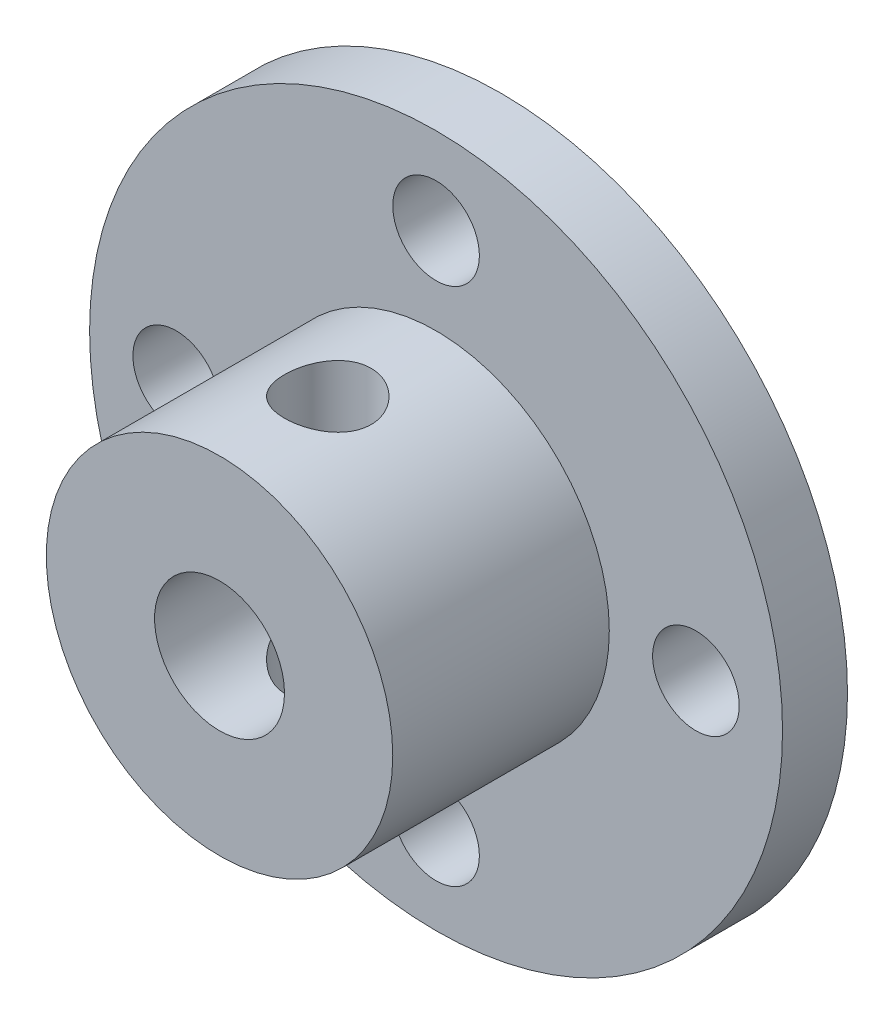
ISO-10303-21;
HEADER;
FILE_DESCRIPTION(('STEP AP214'),'2;1');
FILE_NAME('part.step','',(''),(''),'','','');
FILE_SCHEMA(('AUTOMOTIVE_DESIGN { 1 0 10303 214 1 1 1 1 }'));
ENDSEC;
DATA;
#1=APPLICATION_CONTEXT('core data for automotive mechanical design processes');
#2=APPLICATION_PROTOCOL_DEFINITION('international standard','automotive_design',2000,#1);
#3=PRODUCT_CONTEXT('',#1,'mechanical');
#4=PRODUCT('Part','Part','',(#3));
#5=PRODUCT_RELATED_PRODUCT_CATEGORY('part','',(#4));
#6=PRODUCT_DEFINITION_FORMATION('','',#4);
#7=PRODUCT_DEFINITION_CONTEXT('part definition',#1,'design');
#8=PRODUCT_DEFINITION('design','',#6,#7);
#9=PRODUCT_DEFINITION_SHAPE('','',#8);
#10=(LENGTH_UNIT() NAMED_UNIT(*) SI_UNIT(.MILLI.,.METRE.));
#11=(NAMED_UNIT(*) PLANE_ANGLE_UNIT() SI_UNIT($,.RADIAN.));
#12=(NAMED_UNIT(*) SI_UNIT($,.STERADIAN.) SOLID_ANGLE_UNIT());
#13=UNCERTAINTY_MEASURE_WITH_UNIT(LENGTH_MEASURE(1.E-05),#10,'distance_accuracy_value','');
#14=(GEOMETRIC_REPRESENTATION_CONTEXT(3) GLOBAL_UNCERTAINTY_ASSIGNED_CONTEXT((#13)) GLOBAL_UNIT_ASSIGNED_CONTEXT((#10,
#11,#12)) REPRESENTATION_CONTEXT('',''));
#15=CARTESIAN_POINT('',(0.,0.,0.));
#16=DIRECTION('',(0.,0.,1.));
#17=DIRECTION('',(1.,0.,0.));
#18=AXIS2_PLACEMENT_3D('',#15,#16,#17);
#19=CARTESIAN_POINT('',(0.,0.,3.));
#20=DIRECTION('',(0.,0.,-1.));
#21=DIRECTION('',(-1.,0.,0.));
#22=AXIS2_PLACEMENT_3D('',#19,#20,#21);
#23=CYLINDRICAL_SURFACE('',#22,16.);
#24=CARTESIAN_POINT('',(0.,0.,3.));
#25=DIRECTION('',(0.,0.,1.));
#26=DIRECTION('',(1.,0.,0.));
#27=AXIS2_PLACEMENT_3D('',#24,#25,#26);
#28=CIRCLE('',#27,16.);
#29=CARTESIAN_POINT('',(16.,0.,3.));
#30=VERTEX_POINT('',#29);
#31=EDGE_CURVE('E49',#30,#30,#28,.T.);
#32=ORIENTED_EDGE('',*,*,#31,.F.);
#33=EDGE_LOOP('',(#32));
#34=FACE_BOUND('',#33,.T.);
#35=CARTESIAN_POINT('',(0.,0.,0.));
#36=DIRECTION('',(0.,0.,1.));
#37=DIRECTION('',(1.,0.,0.));
#38=AXIS2_PLACEMENT_3D('',#35,#36,#37);
#39=CIRCLE('',#38,16.);
#40=CARTESIAN_POINT('',(16.,0.,0.));
#41=VERTEX_POINT('',#40);
#42=EDGE_CURVE('E54',#41,#41,#39,.T.);
#43=ORIENTED_EDGE('',*,*,#42,.T.);
#44=EDGE_LOOP('',(#43));
#45=FACE_BOUND('',#44,.T.);
#46=ADVANCED_FACE('F37',(#34,#45),#23,.T.);
#47=CARTESIAN_POINT('',(0.,0.,3.));
#48=DIRECTION('',(0.,0.,1.));
#49=DIRECTION('',(1.,0.,0.));
#50=AXIS2_PLACEMENT_3D('',#47,#48,#49);
#51=PLANE('',#50);
#52=CARTESIAN_POINT('',(0.,12.,3.));
#53=DIRECTION('',(0.,0.,1.));
#54=DIRECTION('',(1.,0.,0.));
#55=AXIS2_PLACEMENT_3D('',#52,#53,#54);
#56=CIRCLE('',#55,2.);
#57=CARTESIAN_POINT('',(2.,12.,3.));
#58=VERTEX_POINT('',#57);
#59=EDGE_CURVE('E149',#58,#58,#56,.T.);
#60=ORIENTED_EDGE('',*,*,#59,.F.);
#61=EDGE_LOOP('',(#60));
#62=FACE_BOUND('',#61,.T.);
#63=CARTESIAN_POINT('',(12.,0.,3.));
#64=DIRECTION('',(0.,0.,1.));
#65=DIRECTION('',(1.,0.,0.));
#66=AXIS2_PLACEMENT_3D('',#63,#64,#65);
#67=CIRCLE('',#66,2.);
#68=CARTESIAN_POINT('',(14.,0.,3.));
#69=VERTEX_POINT('',#68);
#70=EDGE_CURVE('E146',#69,#69,#67,.T.);
#71=ORIENTED_EDGE('',*,*,#70,.F.);
#72=EDGE_LOOP('',(#71));
#73=FACE_BOUND('',#72,.T.);
#74=CARTESIAN_POINT('',(0.,-12.,3.));
#75=DIRECTION('',(0.,0.,1.));
#76=DIRECTION('',(1.,0.,0.));
#77=AXIS2_PLACEMENT_3D('',#74,#75,#76);
#78=CIRCLE('',#77,2.);
#79=CARTESIAN_POINT('',(2.,-12.,3.));
#80=VERTEX_POINT('',#79);
#81=EDGE_CURVE('E140',#80,#80,#78,.T.);
#82=ORIENTED_EDGE('',*,*,#81,.F.);
#83=EDGE_LOOP('',(#82));
#84=FACE_BOUND('',#83,.T.);
#85=CARTESIAN_POINT('',(-12.,0.,3.));
#86=DIRECTION('',(0.,0.,1.));
#87=DIRECTION('',(1.,0.,0.));
#88=AXIS2_PLACEMENT_3D('',#85,#86,#87);
#89=CIRCLE('',#88,2.);
#90=CARTESIAN_POINT('',(-10.,0.,3.));
#91=VERTEX_POINT('',#90);
#92=EDGE_CURVE('E134',#91,#91,#89,.T.);
#93=ORIENTED_EDGE('',*,*,#92,.F.);
#94=EDGE_LOOP('',(#93));
#95=FACE_BOUND('',#94,.T.);
#96=CARTESIAN_POINT('',(0.,0.,3.));
#97=DIRECTION('',(0.,0.,1.));
#98=DIRECTION('',(1.,0.,0.));
#99=AXIS2_PLACEMENT_3D('',#96,#97,#98);
#100=CIRCLE('',#99,8.);
#101=CARTESIAN_POINT('',(8.,0.,3.));
#102=VERTEX_POINT('',#101);
#103=EDGE_CURVE('E121',#102,#102,#100,.T.);
#104=ORIENTED_EDGE('',*,*,#103,.F.);
#105=EDGE_LOOP('',(#104));
#106=FACE_BOUND('',#105,.T.);
#107=ORIENTED_EDGE('',*,*,#31,.T.);
#108=EDGE_LOOP('',(#107));
#109=FACE_BOUND('',#108,.T.);
#110=ADVANCED_FACE('F96',(#62,#73,#84,#95,#106,#109),#51,.T.);
#111=CARTESIAN_POINT('',(0.,0.,0.));
#112=DIRECTION('',(0.,0.,1.));
#113=DIRECTION('',(1.,0.,0.));
#114=AXIS2_PLACEMENT_3D('',#111,#112,#113);
#115=PLANE('',#114);
#116=CARTESIAN_POINT('',(0.,12.,0.));
#117=DIRECTION('',(0.,0.,1.));
#118=DIRECTION('',(1.,0.,0.));
#119=AXIS2_PLACEMENT_3D('',#116,#117,#118);
#120=CIRCLE('',#119,2.);
#121=CARTESIAN_POINT('',(2.,12.,0.));
#122=VERTEX_POINT('',#121);
#123=EDGE_CURVE('E130',#122,#122,#120,.T.);
#124=ORIENTED_EDGE('',*,*,#123,.T.);
#125=EDGE_LOOP('',(#124));
#126=FACE_BOUND('',#125,.T.);
#127=CARTESIAN_POINT('',(12.,0.,0.));
#128=DIRECTION('',(0.,0.,1.));
#129=DIRECTION('',(1.,0.,0.));
#130=AXIS2_PLACEMENT_3D('',#127,#128,#129);
#131=CIRCLE('',#130,2.);
#132=CARTESIAN_POINT('',(14.,0.,0.));
#133=VERTEX_POINT('',#132);
#134=EDGE_CURVE('E143',#133,#133,#131,.T.);
#135=ORIENTED_EDGE('',*,*,#134,.T.);
#136=EDGE_LOOP('',(#135));
#137=FACE_BOUND('',#136,.T.);
#138=CARTESIAN_POINT('',(0.,-12.,0.));
#139=DIRECTION('',(0.,0.,1.));
#140=DIRECTION('',(1.,0.,0.));
#141=AXIS2_PLACEMENT_3D('',#138,#139,#140);
#142=CIRCLE('',#141,2.);
#143=CARTESIAN_POINT('',(2.,-12.,0.));
#144=VERTEX_POINT('',#143);
#145=EDGE_CURVE('E137',#144,#144,#142,.T.);
#146=ORIENTED_EDGE('',*,*,#145,.T.);
#147=EDGE_LOOP('',(#146));
#148=FACE_BOUND('',#147,.T.);
#149=CARTESIAN_POINT('',(-12.,0.,0.));
#150=DIRECTION('',(0.,0.,1.));
#151=DIRECTION('',(1.,0.,0.));
#152=AXIS2_PLACEMENT_3D('',#149,#150,#151);
#153=CIRCLE('',#152,2.);
#154=CARTESIAN_POINT('',(-10.,0.,0.));
#155=VERTEX_POINT('',#154);
#156=EDGE_CURVE('E131',#155,#155,#153,.T.);
#157=ORIENTED_EDGE('',*,*,#156,.T.);
#158=EDGE_LOOP('',(#157));
#159=FACE_BOUND('',#158,.T.);
#160=ORIENTED_EDGE('',*,*,#42,.F.);
#161=EDGE_LOOP('',(#160));
#162=FACE_BOUND('',#161,.T.);
#163=ADVANCED_FACE('F99',(#126,#137,#148,#159,#162),#115,.F.);
#164=CARTESIAN_POINT('',(0.,0.,13.));
#165=DIRECTION('',(0.,0.,1.));
#166=DIRECTION('',(1.,0.,0.));
#167=AXIS2_PLACEMENT_3D('',#164,#165,#166);
#168=PLANE('',#167);
#169=CARTESIAN_POINT('',(0.,0.,13.));
#170=DIRECTION('',(0.,0.,1.));
#171=DIRECTION('',(1.,0.,0.));
#172=AXIS2_PLACEMENT_3D('',#169,#170,#171);
#173=CIRCLE('',#172,8.);
#174=CARTESIAN_POINT('',(8.,0.,13.));
#175=VERTEX_POINT('',#174);
#176=EDGE_CURVE('E119',#175,#175,#173,.T.);
#177=ORIENTED_EDGE('',*,*,#176,.T.);
#178=EDGE_LOOP('',(#177));
#179=FACE_BOUND('',#178,.T.);
#180=CARTESIAN_POINT('',(0.,0.,13.));
#181=DIRECTION('',(0.,0.,1.));
#182=DIRECTION('',(1.,0.,0.));
#183=AXIS2_PLACEMENT_3D('',#180,#181,#182);
#184=CIRCLE('',#183,3.);
#185=CARTESIAN_POINT('',(3.,0.,13.));
#186=VERTEX_POINT('',#185);
#187=EDGE_CURVE('E125',#186,#186,#184,.T.);
#188=ORIENTED_EDGE('',*,*,#187,.F.);
#189=EDGE_LOOP('',(#188));
#190=FACE_BOUND('',#189,.T.);
#191=ADVANCED_FACE('F94',(#179,#190),#168,.T.);
#192=CARTESIAN_POINT('',(0.,0.,13.));
#193=DIRECTION('',(0.,0.,-1.));
#194=DIRECTION('',(-1.,0.,0.));
#195=AXIS2_PLACEMENT_3D('',#192,#193,#194);
#196=CYLINDRICAL_SURFACE('',#195,8.);
#197=CARTESIAN_POINT('',(0.,-8.,10.));
#198=CARTESIAN_POINT('',(0.110501451559642,-7.9999981315735,9.99999689901579));
#199=CARTESIAN_POINT('',(0.221037543774351,-7.99768770842435,9.99081126563495));
#200=CARTESIAN_POINT('',(0.438941765027377,-7.98869485106526,9.95436646492399));
#201=CARTESIAN_POINT('',(0.546308062494319,-7.98200993893301,9.92709705394953));
#202=CARTESIAN_POINT('',(0.754694496243435,-7.96500835109376,9.85541432871722));
#203=CARTESIAN_POINT('',(0.855722084573335,-7.95469603789411,9.81102160171298));
#204=CARTESIAN_POINT('',(1.04889617587257,-7.93153791743495,9.70642481327355));
#205=CARTESIAN_POINT('',(1.14104237913168,-7.91869202472209,9.64622021850804));
#206=CARTESIAN_POINT('',(1.31573590306789,-7.89156551455591,9.51039894712776));
#207=CARTESIAN_POINT('',(1.39807425341474,-7.87726276197502,9.43451790005459));
#208=CARTESIAN_POINT('',(1.54899856960443,-7.84898160157248,9.27006372678795));
#209=CARTESIAN_POINT('',(1.61758298259892,-7.83500323053157,9.18148916940409));
#210=CARTESIAN_POINT('',(1.74003539039863,-7.80873034264225,8.99253969768401));
#211=CARTESIAN_POINT('',(1.79366962123352,-7.79646392619748,8.89200902558836));
#212=CARTESIAN_POINT('',(1.88319587806766,-7.77532659757355,8.68300211778662));
#213=CARTESIAN_POINT('',(1.91909074058685,-7.76645514259225,8.57452715555731));
#214=CARTESIAN_POINT('',(1.97140644907302,-7.7533396892843,8.35500866906445));
#215=CARTESIAN_POINT('',(1.98820302444274,-7.74900654662681,8.24406013861601));
#216=CARTESIAN_POINT('',(2.00301570008854,-7.74519149946122,8.02084190800087));
#217=CARTESIAN_POINT('',(2.00103485575748,-7.74570880570571,7.90857242574382));
#218=CARTESIAN_POINT('',(1.97864869951961,-7.75145607355756,7.6887789230062));
#219=CARTESIAN_POINT('',(1.95869112025418,-7.75657150676391,7.58120583804623));
#220=CARTESIAN_POINT('',(1.90163224920399,-7.77075612894758,7.37098526545192));
#221=CARTESIAN_POINT('',(1.86452973609252,-7.77982559958985,7.26833812929477));
#222=CARTESIAN_POINT('',(1.77385263724958,-7.80100151874212,7.06968264499716));
#223=CARTESIAN_POINT('',(1.72011555631056,-7.81313769959755,6.97375177094724));
#224=CARTESIAN_POINT('',(1.59780836801993,-7.83906281127988,6.79210838699091));
#225=CARTESIAN_POINT('',(1.52923566507845,-7.85285203112837,6.70639766924367));
#226=CARTESIAN_POINT('',(1.37688456624163,-7.88101174053188,6.54506184574079));
#227=CARTESIAN_POINT('',(1.29272834422115,-7.89538759304001,6.46979401325153));
#228=CARTESIAN_POINT('',(1.11281589000493,-7.92274620771675,6.3343716767148));
#229=CARTESIAN_POINT('',(1.01705930361059,-7.93572892732543,6.27421763431525));
#230=CARTESIAN_POINT('',(0.816154518241856,-7.9589030945892,6.17059921836749));
#231=CARTESIAN_POINT('',(0.710975190944831,-7.96908480170303,6.12719287966076));
#232=CARTESIAN_POINT('',(0.49450134419051,-7.98543889321888,6.05877692572057));
#233=CARTESIAN_POINT('',(0.383207998867313,-7.99161204452374,6.03376379144248));
#234=CARTESIAN_POINT('',(0.160719960520036,-7.999139990285,6.00338991258822));
#235=CARTESIAN_POINT('',(0.0495956266509465,-8.00061404677705,5.9975426318996));
#236=CARTESIAN_POINT('',(-0.172043833068677,-7.99891739752601,6.00433200274065));
#237=CARTESIAN_POINT('',(-0.28255901285946,-7.99574710989128,6.01696699039884));
#238=CARTESIAN_POINT('',(-0.498152358368656,-7.98519441503143,6.05996121118851));
#239=CARTESIAN_POINT('',(-0.603286825291673,-7.97787512247748,6.09005501796932));
#240=CARTESIAN_POINT('',(-0.807009723270016,-7.95984942178845,6.16680944537126));
#241=CARTESIAN_POINT('',(-0.905597492043513,-7.94914267159856,6.21347173908423));
#242=CARTESIAN_POINT('',(-1.0953641792398,-7.92524410568414,6.3229815051663));
#243=CARTESIAN_POINT('',(-1.18638058911444,-7.91201156489243,6.38610148319568));
#244=CARTESIAN_POINT('',(-1.35670215152433,-7.88459345583226,6.52638654506263));
#245=CARTESIAN_POINT('',(-1.43600527863068,-7.87040772335606,6.60355405282254));
#246=CARTESIAN_POINT('',(-1.58265409076364,-7.84225275947695,6.77200261445929));
#247=CARTESIAN_POINT('',(-1.64965849016271,-7.82829738916375,6.86358360400323));
#248=CARTESIAN_POINT('',(-1.7673476786836,-7.80257171169652,7.05697684595429));
#249=CARTESIAN_POINT('',(-1.81803319221058,-7.79080130756035,7.15878864394634));
#250=CARTESIAN_POINT('',(-1.90126856081239,-7.77090792979553,7.36920762988411));
#251=CARTESIAN_POINT('',(-1.93392586220542,-7.76276340389207,7.47777017112535));
#252=CARTESIAN_POINT('',(-1.98046087993837,-7.75102325453578,7.69907951718548));
#253=CARTESIAN_POINT('',(-1.99434270330488,-7.74742663626582,7.81182540137665));
#254=CARTESIAN_POINT('',(-2.00271812044533,-7.74526534938609,8.03482803180694));
#255=CARTESIAN_POINT('',(-1.99775719704016,-7.74655910304351,8.14506324683297));
#256=CARTESIAN_POINT('',(-1.96983637108382,-7.7537054534379,8.36307185155731));
#257=CARTESIAN_POINT('',(-1.94687683024903,-7.75955795855809,8.47084529068487));
#258=CARTESIAN_POINT('',(-1.88390842592373,-7.77508347576963,8.68027794542054));
#259=CARTESIAN_POINT('',(-1.84400187290717,-7.78473353648412,8.78196974032028));
#260=CARTESIAN_POINT('',(-1.74835321814009,-7.80677007633105,8.97728717695159));
#261=CARTESIAN_POINT('',(-1.69260892004558,-7.81915693494364,9.07091169758256));
#262=CARTESIAN_POINT('',(-1.56515699818285,-7.8456751235135,9.25007283866936));
#263=CARTESIAN_POINT('',(-1.49307088388301,-7.85984353109009,9.33533476456528));
#264=CARTESIAN_POINT('',(-1.33571916158631,-7.88810702995048,9.49272939306054));
#265=CARTESIAN_POINT('',(-1.25045042834819,-7.90220210302746,9.56485897348396));
#266=CARTESIAN_POINT('',(-1.06729011560345,-7.92903540863551,9.69521507808614));
#267=CARTESIAN_POINT('',(-0.96919789642185,-7.94174444487824,9.75316615156211));
#268=CARTESIAN_POINT('',(-0.764354746013969,-7.96406566633491,9.85166328392071));
#269=CARTESIAN_POINT('',(-0.65761008458232,-7.97368006933042,9.89222181419805));
#270=CARTESIAN_POINT('',(-0.459213670991295,-7.98730746087389,9.94876244043954));
#271=CARTESIAN_POINT('',(-0.368506894544091,-7.9920344673692,9.96793499073791));
#272=CARTESIAN_POINT('',(-0.185208095381711,-7.99838140309264,9.99355459149592));
#273=CARTESIAN_POINT('',(-0.0926162149901549,-8.00000156601192,10.0000025990737));
#274=CARTESIAN_POINT('',(0.,-8.,10.));
#275=B_SPLINE_CURVE_WITH_KNOTS('',3,(#197,#198,#199,#200,#201,#202,#203,#204,#205,#206,#207,
#208,#209,#210,#211,#212,#213,#214,#215,#216,#217,#218,#219,#220,#221,#222,#223,#224,#225,#226,
#227,#228,#229,#230,#231,#232,#233,#234,#235,#236,#237,#238,#239,#240,#241,#242,#243,#244,#245,
#246,#247,#248,#249,#250,#251,#252,#253,#254,#255,#256,#257,#258,#259,#260,#261,#262,#263,#264,
#265,#266,#267,#268,#269,#270,#271,#272,#273,#274),.UNSPECIFIED.,.T.,.F.,(4,2,2,2,2,2,2,2,2,2,2,
2,2,2,2,2,2,2,2,2,2,2,2,2,2,2,2,2,2,2,2,2,2,2,2,2,2,2,4),(0.,0.33116494996252,0.662517650351866,
0.99347320304814,1.32443992022577,1.66152580582852,1.99864972773416,2.34078196727742,
2.68285948225824,3.01808393468093,3.3532538415469,3.68029996013785,4.00736937959145,
4.337740371696,4.66816921119311,5.00802001296453,5.34788119415424,5.6889097201658,
6.02987298255951,6.36211078603462,6.69431868154751,7.02160366023144,7.34892169767481,
7.68204783424897,8.01523150681786,8.35659345610396,8.69794025003772,9.03723006156476,
9.37644564340972,9.70591707202578,10.0353818794581,10.3628853408369,10.6904342418696,
11.0265276855097,11.3627009303165,11.7049624733721,12.0469781843289,12.3245632392729,
12.6021274139515),.UNSPECIFIED.);
#276=CARTESIAN_POINT('',(0.,-8.,10.));
#277=VERTEX_POINT('',#276);
#278=EDGE_CURVE('E85',#277,#277,#275,.T.);
#279=ORIENTED_EDGE('',*,*,#278,.T.);
#280=EDGE_LOOP('',(#279));
#281=FACE_BOUND('',#280,.T.);
#282=CARTESIAN_POINT('',(0.,8.,10.));
#283=CARTESIAN_POINT('',(-0.110501451559642,7.9999981315735,9.99999689901579));
#284=CARTESIAN_POINT('',(-0.221037543774351,7.99768770842435,9.99081126563495));
#285=CARTESIAN_POINT('',(-0.438941765027377,7.98869485106526,9.95436646492399));
#286=CARTESIAN_POINT('',(-0.546308062494319,7.98200993893301,9.92709705394953));
#287=CARTESIAN_POINT('',(-0.754694496243435,7.96500835109376,9.85541432871722));
#288=CARTESIAN_POINT('',(-0.855722084573335,7.95469603789411,9.81102160171298));
#289=CARTESIAN_POINT('',(-1.04889617587257,7.93153791743495,9.70642481327355));
#290=CARTESIAN_POINT('',(-1.14104237913168,7.91869202472209,9.64622021850804));
#291=CARTESIAN_POINT('',(-1.31573590306789,7.89156551455591,9.51039894712776));
#292=CARTESIAN_POINT('',(-1.39807425341474,7.87726276197502,9.43451790005459));
#293=CARTESIAN_POINT('',(-1.54899856960443,7.84898160157248,9.27006372678795));
#294=CARTESIAN_POINT('',(-1.61758298259892,7.83500323053157,9.18148916940409));
#295=CARTESIAN_POINT('',(-1.74003539039863,7.80873034264225,8.99253969768401));
#296=CARTESIAN_POINT('',(-1.79366962123352,7.79646392619748,8.89200902558836));
#297=CARTESIAN_POINT('',(-1.88319587806766,7.77532659757355,8.68300211778662));
#298=CARTESIAN_POINT('',(-1.91909074058685,7.76645514259225,8.57452715555731));
#299=CARTESIAN_POINT('',(-1.97140644907302,7.7533396892843,8.35500866906445));
#300=CARTESIAN_POINT('',(-1.98820302444274,7.74900654662681,8.24406013861601));
#301=CARTESIAN_POINT('',(-2.00301570008854,7.74519149946122,8.02084190800087));
#302=CARTESIAN_POINT('',(-2.00103485575748,7.74570880570571,7.90857242574382));
#303=CARTESIAN_POINT('',(-1.97864869951961,7.75145607355756,7.6887789230062));
#304=CARTESIAN_POINT('',(-1.95869112025418,7.75657150676391,7.58120583804623));
#305=CARTESIAN_POINT('',(-1.90163224920399,7.77075612894758,7.37098526545192));
#306=CARTESIAN_POINT('',(-1.86452973609252,7.77982559958985,7.26833812929477));
#307=CARTESIAN_POINT('',(-1.77385263724958,7.80100151874212,7.06968264499716));
#308=CARTESIAN_POINT('',(-1.72011555631056,7.81313769959755,6.97375177094724));
#309=CARTESIAN_POINT('',(-1.59780836801993,7.83906281127988,6.79210838699091));
#310=CARTESIAN_POINT('',(-1.52923566507845,7.85285203112837,6.70639766924367));
#311=CARTESIAN_POINT('',(-1.37688456624163,7.88101174053188,6.54506184574079));
#312=CARTESIAN_POINT('',(-1.29272834422115,7.89538759304001,6.46979401325153));
#313=CARTESIAN_POINT('',(-1.11281589000493,7.92274620771675,6.3343716767148));
#314=CARTESIAN_POINT('',(-1.01705930361059,7.93572892732543,6.27421763431525));
#315=CARTESIAN_POINT('',(-0.816154518241856,7.9589030945892,6.17059921836749));
#316=CARTESIAN_POINT('',(-0.710975190944831,7.96908480170303,6.12719287966076));
#317=CARTESIAN_POINT('',(-0.49450134419051,7.98543889321888,6.05877692572057));
#318=CARTESIAN_POINT('',(-0.383207998867313,7.99161204452374,6.03376379144248));
#319=CARTESIAN_POINT('',(-0.160719960520036,7.999139990285,6.00338991258822));
#320=CARTESIAN_POINT('',(-0.0495956266509465,8.00061404677705,5.9975426318996));
#321=CARTESIAN_POINT('',(0.172043833068677,7.99891739752601,6.00433200274065));
#322=CARTESIAN_POINT('',(0.28255901285946,7.99574710989128,6.01696699039884));
#323=CARTESIAN_POINT('',(0.498152358368656,7.98519441503143,6.05996121118851));
#324=CARTESIAN_POINT('',(0.603286825291673,7.97787512247748,6.09005501796932));
#325=CARTESIAN_POINT('',(0.807009723270016,7.95984942178845,6.16680944537126));
#326=CARTESIAN_POINT('',(0.905597492043513,7.94914267159856,6.21347173908423));
#327=CARTESIAN_POINT('',(1.0953641792398,7.92524410568414,6.3229815051663));
#328=CARTESIAN_POINT('',(1.18638058911444,7.91201156489243,6.38610148319568));
#329=CARTESIAN_POINT('',(1.35670215152433,7.88459345583226,6.52638654506263));
#330=CARTESIAN_POINT('',(1.43600527863068,7.87040772335606,6.60355405282254));
#331=CARTESIAN_POINT('',(1.58265409076364,7.84225275947695,6.77200261445929));
#332=CARTESIAN_POINT('',(1.64965849016271,7.82829738916375,6.86358360400323));
#333=CARTESIAN_POINT('',(1.7673476786836,7.80257171169652,7.05697684595429));
#334=CARTESIAN_POINT('',(1.81803319221058,7.79080130756035,7.15878864394634));
#335=CARTESIAN_POINT('',(1.90126856081239,7.77090792979553,7.36920762988411));
#336=CARTESIAN_POINT('',(1.93392586220542,7.76276340389207,7.47777017112535));
#337=CARTESIAN_POINT('',(1.98046087993837,7.75102325453578,7.69907951718548));
#338=CARTESIAN_POINT('',(1.99434270330488,7.74742663626582,7.81182540137665));
#339=CARTESIAN_POINT('',(2.00271812044533,7.74526534938609,8.03482803180694));
#340=CARTESIAN_POINT('',(1.99775719704016,7.74655910304351,8.14506324683297));
#341=CARTESIAN_POINT('',(1.96983637108382,7.7537054534379,8.36307185155731));
#342=CARTESIAN_POINT('',(1.94687683024903,7.75955795855809,8.47084529068487));
#343=CARTESIAN_POINT('',(1.88390842592373,7.77508347576963,8.68027794542054));
#344=CARTESIAN_POINT('',(1.84400187290717,7.78473353648412,8.78196974032028));
#345=CARTESIAN_POINT('',(1.74835321814009,7.80677007633105,8.97728717695159));
#346=CARTESIAN_POINT('',(1.69260892004558,7.81915693494364,9.07091169758256));
#347=CARTESIAN_POINT('',(1.56515699818285,7.8456751235135,9.25007283866936));
#348=CARTESIAN_POINT('',(1.49307088388301,7.85984353109009,9.33533476456528));
#349=CARTESIAN_POINT('',(1.33571916158631,7.88810702995048,9.49272939306054));
#350=CARTESIAN_POINT('',(1.25045042834819,7.90220210302746,9.56485897348396));
#351=CARTESIAN_POINT('',(1.06729011560345,7.92903540863551,9.69521507808614));
#352=CARTESIAN_POINT('',(0.96919789642185,7.94174444487824,9.75316615156211));
#353=CARTESIAN_POINT('',(0.764354746013969,7.96406566633491,9.85166328392071));
#354=CARTESIAN_POINT('',(0.65761008458232,7.97368006933042,9.89222181419805));
#355=CARTESIAN_POINT('',(0.459213670991295,7.98730746087389,9.94876244043954));
#356=CARTESIAN_POINT('',(0.368506894544091,7.9920344673692,9.96793499073791));
#357=CARTESIAN_POINT('',(0.185208095381711,7.99838140309264,9.99355459149592));
#358=CARTESIAN_POINT('',(0.0926162149901549,8.00000156601192,10.0000025990737));
#359=CARTESIAN_POINT('',(0.,8.,10.));
#360=B_SPLINE_CURVE_WITH_KNOTS('',3,(#282,#283,#284,#285,#286,#287,#288,#289,#290,#291,#292,
#293,#294,#295,#296,#297,#298,#299,#300,#301,#302,#303,#304,#305,#306,#307,#308,#309,#310,#311,
#312,#313,#314,#315,#316,#317,#318,#319,#320,#321,#322,#323,#324,#325,#326,#327,#328,#329,#330,
#331,#332,#333,#334,#335,#336,#337,#338,#339,#340,#341,#342,#343,#344,#345,#346,#347,#348,#349,
#350,#351,#352,#353,#354,#355,#356,#357,#358,#359),.UNSPECIFIED.,.T.,.F.,(4,2,2,2,2,2,2,2,2,2,2,
2,2,2,2,2,2,2,2,2,2,2,2,2,2,2,2,2,2,2,2,2,2,2,2,2,2,2,4),(0.,0.33116494996252,0.662517650351866,
0.99347320304814,1.32443992022577,1.66152580582852,1.99864972773416,2.34078196727742,
2.68285948225824,3.01808393468093,3.3532538415469,3.68029996013785,4.00736937959145,
4.337740371696,4.66816921119311,5.00802001296453,5.34788119415424,5.6889097201658,
6.02987298255951,6.36211078603462,6.69431868154751,7.02160366023144,7.34892169767481,
7.68204783424897,8.01523150681786,8.35659345610396,8.69794025003772,9.03723006156476,
9.37644564340972,9.70591707202578,10.0353818794581,10.3628853408369,10.6904342418696,
11.0265276855097,11.3627009303165,11.7049624733721,12.0469781843289,12.3245632392729,
12.6021274139515),.UNSPECIFIED.);
#361=CARTESIAN_POINT('',(0.,8.,10.));
#362=VERTEX_POINT('',#361);
#363=EDGE_CURVE('E79',#362,#362,#360,.T.);
#364=ORIENTED_EDGE('',*,*,#363,.T.);
#365=EDGE_LOOP('',(#364));
#366=FACE_BOUND('',#365,.T.);
#367=ORIENTED_EDGE('',*,*,#176,.F.);
#368=EDGE_LOOP('',(#367));
#369=FACE_BOUND('',#368,.T.);
#370=ORIENTED_EDGE('',*,*,#103,.T.);
#371=EDGE_LOOP('',(#370));
#372=FACE_BOUND('',#371,.T.);
#373=ADVANCED_FACE('F90',(#281,#366,#369,#372),#196,.T.);
#374=CARTESIAN_POINT('',(0.,0.,13.));
#375=DIRECTION('',(0.,0.,-1.));
#376=DIRECTION('',(-1.,0.,0.));
#377=AXIS2_PLACEMENT_3D('',#374,#375,#376);
#378=CYLINDRICAL_SURFACE('',#377,3.);
#379=CARTESIAN_POINT('',(0.,-3.,10.));
#380=CARTESIAN_POINT('',(0.100484716668078,-3.0000004164484,10.0000005496325));
#381=CARTESIAN_POINT('',(0.200969087132901,-2.99490802753388,9.9923860300445));
#382=CARTESIAN_POINT('',(0.398733058031681,-2.97504652423809,9.96240313589434));
#383=CARTESIAN_POINT('',(0.496011113955007,-2.96027281581235,9.94002775687671));
#384=CARTESIAN_POINT('',(0.684212307854249,-2.92250482404708,9.88189228267516));
#385=CARTESIAN_POINT('',(0.775162872657554,-2.89954905493315,9.84619485999206));
#386=CARTESIAN_POINT('',(0.94941529099726,-2.8472613787744,9.7629366367285));
#387=CARTESIAN_POINT('',(1.03271603160967,-2.8179285460551,9.71537411369944));
#388=CARTESIAN_POINT('',(1.19728470077011,-2.75227329369838,9.60534306263257));
#389=CARTESIAN_POINT('',(1.27778030546067,-2.71556897579319,9.54195213925711));
#390=CARTESIAN_POINT('',(1.42772804469274,-2.63982313083466,9.40426995134155));
#391=CARTESIAN_POINT('',(1.49716405543888,-2.60077830356832,9.32996307016226));
#392=CARTESIAN_POINT('',(1.63422297745496,-2.51728264678794,9.15894763238733));
#393=CARTESIAN_POINT('',(1.6998318636275,-2.47295067937795,9.06055434679655));
#394=CARTESIAN_POINT('',(1.81350357014175,-2.3908414735282,8.85163662235347));
#395=CARTESIAN_POINT('',(1.86159673426503,-2.35305295954668,8.74113359843726));
#396=CARTESIAN_POINT('',(1.92674035011438,-2.29976266641461,8.54328870657837));
#397=CARTESIAN_POINT('',(1.94874447236008,-2.28097627892403,8.45847154712609));
#398=CARTESIAN_POINT('',(1.98150617785228,-2.25257969659604,8.28525549525835));
#399=CARTESIAN_POINT('',(1.99228314651963,-2.24295368744147,8.19686305127394));
#400=CARTESIAN_POINT('',(2.00191364141227,-2.23436605608045,8.01852522114353));
#401=CARTESIAN_POINT('',(2.00071842917524,-2.23544802558502,7.9285749765476));
#402=CARTESIAN_POINT('',(1.98637581333356,-2.24819775483425,7.75036502650024));
#403=CARTESIAN_POINT('',(1.97321828380393,-2.25987448286881,7.66210681797187));
#404=CARTESIAN_POINT('',(1.93664994217326,-2.2912718598996,7.49353294875812));
#405=CARTESIAN_POINT('',(1.91371711479477,-2.31061488324375,7.41303866406123));
#406=CARTESIAN_POINT('',(1.85870118583424,-2.35509622933623,7.25697630902422));
#407=CARTESIAN_POINT('',(1.8266150732855,-2.3802364585489,7.18140986976135));
#408=CARTESIAN_POINT('',(1.74673818732648,-2.43964196377947,7.02097460464356));
#409=CARTESIAN_POINT('',(1.69708052300445,-2.47472317740626,6.9373400995169));
#410=CARTESIAN_POINT('',(1.58668960438221,-2.54691537733438,6.77861660471425));
#411=CARTESIAN_POINT('',(1.52594268999614,-2.58402882709328,6.70353834223793));
#412=CARTESIAN_POINT('',(1.37981165322308,-2.66543343763724,6.54745745439658));
#413=CARTESIAN_POINT('',(1.29193938283656,-2.7095474472056,6.46866595131724));
#414=CARTESIAN_POINT('',(1.10200799908008,-2.79218100665212,6.32680350546151));
#415=CARTESIAN_POINT('',(0.999962299343694,-2.83070577648042,6.26371785459102));
#416=CARTESIAN_POINT('',(0.804857827096527,-2.89145404090364,6.16652228137713));
#417=CARTESIAN_POINT('',(0.713957643371907,-2.9153926116554,6.12915663666106));
#418=CARTESIAN_POINT('',(0.526036043935477,-2.95507719030499,6.06789507437463));
#419=CARTESIAN_POINT('',(0.429019879001647,-2.97083012127544,6.04398777286778));
#420=CARTESIAN_POINT('',(0.230985453172278,-2.99275882156808,6.010838834762));
#421=CARTESIAN_POINT('',(0.129951811934155,-2.99889322461187,6.00166053906174));
#422=CARTESIAN_POINT('',(-0.0724415193893495,-3.00083114965147,5.99875291143779));
#423=CARTESIAN_POINT('',(-0.173801186186628,-2.99663539385634,6.00502249951123));
#424=CARTESIAN_POINT('',(-0.366455717204242,-2.97899589424273,6.03162405556195));
#425=CARTESIAN_POINT('',(-0.457957444679196,-2.96622246390226,6.05093729775522));
#426=CARTESIAN_POINT('',(-0.636116392427403,-2.93318449284837,6.10159568601286));
#427=CARTESIAN_POINT('',(-0.722772837571136,-2.91291875746989,6.13294275092821));
#428=CARTESIAN_POINT('',(-0.894664750465999,-2.86496352529158,6.20865229704492));
#429=CARTESIAN_POINT('',(-0.979496184631422,-2.83689870135785,6.25368815408186));
#430=CARTESIAN_POINT('',(-1.14068302395729,-2.7760185561151,6.35443328994628));
#431=CARTESIAN_POINT('',(-1.21703314820091,-2.74320030403941,6.41014916053217));
#432=CARTESIAN_POINT('',(-1.37185445482324,-2.6695454665343,6.54060786815751));
#433=CARTESIAN_POINT('',(-1.44875187569565,-2.62826156800165,6.61696626007509));
#434=CARTESIAN_POINT('',(-1.58933968069449,-2.54571173085957,6.78111142995712));
#435=CARTESIAN_POINT('',(-1.6530209365723,-2.50444582417845,6.86890603910751));
#436=CARTESIAN_POINT('',(-1.76124776549313,-2.4293967897058,7.04714241276813));
#437=CARTESIAN_POINT('',(-1.80695636125283,-2.39527597025701,7.13673203346221));
#438=CARTESIAN_POINT('',(-1.88496213740264,-2.33438974266154,7.32387265244364));
#439=CARTESIAN_POINT('',(-1.91728345682189,-2.30761112529822,7.42140893830463));
#440=CARTESIAN_POINT('',(-1.9623584346534,-2.26933208182633,7.60456448719542));
#441=CARTESIAN_POINT('',(-1.97758597566225,-2.25594998021257,7.68917180987601));
#442=CARTESIAN_POINT('',(-1.99699205923373,-2.23879466438398,7.86057328131839));
#443=CARTESIAN_POINT('',(-2.00118260285317,-2.23501101347816,7.9473649511395));
#444=CARTESIAN_POINT('',(-1.99823921981266,-2.23764201149981,8.1206430567237));
#445=CARTESIAN_POINT('',(-1.99109858767783,-2.24406269907463,8.20712928137376));
#446=CARTESIAN_POINT('',(-1.96596997224746,-2.26610452403491,8.37734352853212));
#447=CARTESIAN_POINT('',(-1.94796751728258,-2.28173793527615,8.46106771382433));
#448=CARTESIAN_POINT('',(-1.89593035657494,-2.32526843904801,8.64571118648124));
#449=CARTESIAN_POINT('',(-1.85890187130765,-2.35532333574983,8.74526771294333));
#450=CARTESIAN_POINT('',(-1.7708452623622,-2.42222161121309,8.93548683438421));
#451=CARTESIAN_POINT('',(-1.71979748341259,-2.459074496867,9.02613669799169));
#452=CARTESIAN_POINT('',(-1.60398280555153,-2.53617186577119,9.19928188713623));
#453=CARTESIAN_POINT('',(-1.53898309894021,-2.5764658739228,9.28159874542305));
#454=CARTESIAN_POINT('',(-1.39671768031094,-2.65628301537844,9.43532247825793));
#455=CARTESIAN_POINT('',(-1.31944821025748,-2.69580590832396,9.50672599702921));
#456=CARTESIAN_POINT('',(-1.14145732976974,-2.77631551964082,9.64671210430908));
#457=CARTESIAN_POINT('',(-1.03896166955575,-2.81669805449991,9.71341864017832));
#458=CARTESIAN_POINT('',(-0.820868555771217,-2.88777665874161,9.8279132766653));
#459=CARTESIAN_POINT('',(-0.705292062449156,-2.91848793445255,9.87573110682395));
#460=CARTESIAN_POINT('',(-0.491435069835745,-2.96101644836895,9.94115457816378));
#461=CARTESIAN_POINT('',(-0.395012325257921,-2.97551480368935,9.96311103909862));
#462=CARTESIAN_POINT('',(-0.199058012023946,-2.99500280141853,9.9925280325381));
#463=CARTESIAN_POINT('',(-0.0995288361880077,-2.99999958751315,9.99999945559601));
#464=CARTESIAN_POINT('',(0.,-3.,10.));
#465=B_SPLINE_CURVE_WITH_KNOTS('',3,(#379,#380,#381,#382,#383,#384,#385,#386,#387,#388,#389,
#390,#391,#392,#393,#394,#395,#396,#397,#398,#399,#400,#401,#402,#403,#404,#405,#406,#407,#408,
#409,#410,#411,#412,#413,#414,#415,#416,#417,#418,#419,#420,#421,#422,#423,#424,#425,#426,#427,
#428,#429,#430,#431,#432,#433,#434,#435,#436,#437,#438,#439,#440,#441,#442,#443,#444,#445,#446,
#447,#448,#449,#450,#451,#452,#453,#454,#455,#456,#457,#458,#459,#460,#461,#462,#463,#464),
.UNSPECIFIED.,.T.,.F.,(4,2,2,2,2,2,2,2,2,2,2,2,2,2,2,2,2,2,2,2,2,2,2,2,2,2,2,2,2,2,2,2,2,2,2,2,
2,2,2,2,2,2,4),(0.,0.3010532265054,0.602249414348688,0.902046153190231,1.20188643867387,
1.52717029000557,1.85292411604319,2.23006683295982,2.60655305445439,2.87433693676029,
3.14165767845809,3.41006711735378,3.67870397263352,3.93548862198022,4.19235783805079,
4.50147574660874,4.81097703780057,5.18718954496752,5.56304840301363,5.86524087696758,
6.16717735142814,6.47040883294251,6.77361911533415,7.05553084792473,7.33748755138271,
7.63652346829516,7.93574454945204,8.28228176141292,8.62905753175758,8.94649935304476,
9.26336626640723,9.52324048016135,9.78283200333091,10.0425772028455,10.302669238524,
10.6320660870419,10.9619271337795,11.2977924520448,11.6337608397015,12.0179535155883,
12.4015390656082,12.6999529136674,12.9981423125957),.UNSPECIFIED.);
#466=CARTESIAN_POINT('',(0.,-3.,10.));
#467=VERTEX_POINT('',#466);
#468=EDGE_CURVE('E40',#467,#467,#465,.T.);
#469=ORIENTED_EDGE('',*,*,#468,.F.);
#470=EDGE_LOOP('',(#469));
#471=FACE_BOUND('',#470,.T.);
#472=CARTESIAN_POINT('',(0.,3.,10.));
#473=CARTESIAN_POINT('',(-0.100484716668078,3.0000004164484,10.0000005496325));
#474=CARTESIAN_POINT('',(-0.200969087132901,2.99490802753388,9.9923860300445));
#475=CARTESIAN_POINT('',(-0.398733058031681,2.97504652423809,9.96240313589434));
#476=CARTESIAN_POINT('',(-0.496011113955007,2.96027281581235,9.94002775687671));
#477=CARTESIAN_POINT('',(-0.684212307854249,2.92250482404708,9.88189228267516));
#478=CARTESIAN_POINT('',(-0.775162872657554,2.89954905493315,9.84619485999206));
#479=CARTESIAN_POINT('',(-0.94941529099726,2.8472613787744,9.7629366367285));
#480=CARTESIAN_POINT('',(-1.03271603160967,2.8179285460551,9.71537411369944));
#481=CARTESIAN_POINT('',(-1.19728470077011,2.75227329369838,9.60534306263257));
#482=CARTESIAN_POINT('',(-1.27778030546067,2.71556897579319,9.54195213925711));
#483=CARTESIAN_POINT('',(-1.42772804469274,2.63982313083466,9.40426995134155));
#484=CARTESIAN_POINT('',(-1.49716405543888,2.60077830356832,9.32996307016226));
#485=CARTESIAN_POINT('',(-1.63422297745496,2.51728264678794,9.15894763238733));
#486=CARTESIAN_POINT('',(-1.6998318636275,2.47295067937795,9.06055434679655));
#487=CARTESIAN_POINT('',(-1.81350357014175,2.3908414735282,8.85163662235347));
#488=CARTESIAN_POINT('',(-1.86159673426503,2.35305295954668,8.74113359843726));
#489=CARTESIAN_POINT('',(-1.92674035011438,2.29976266641461,8.54328870657837));
#490=CARTESIAN_POINT('',(-1.94874447236008,2.28097627892403,8.45847154712609));
#491=CARTESIAN_POINT('',(-1.98150617785228,2.25257969659604,8.28525549525835));
#492=CARTESIAN_POINT('',(-1.99228314651963,2.24295368744147,8.19686305127394));
#493=CARTESIAN_POINT('',(-2.00191364141227,2.23436605608045,8.01852522114353));
#494=CARTESIAN_POINT('',(-2.00071842917524,2.23544802558502,7.9285749765476));
#495=CARTESIAN_POINT('',(-1.98637581333356,2.24819775483425,7.75036502650024));
#496=CARTESIAN_POINT('',(-1.97321828380393,2.25987448286881,7.66210681797187));
#497=CARTESIAN_POINT('',(-1.93664994217326,2.2912718598996,7.49353294875812));
#498=CARTESIAN_POINT('',(-1.91371711479477,2.31061488324375,7.41303866406123));
#499=CARTESIAN_POINT('',(-1.85870118583424,2.35509622933623,7.25697630902422));
#500=CARTESIAN_POINT('',(-1.8266150732855,2.3802364585489,7.18140986976135));
#501=CARTESIAN_POINT('',(-1.74673818732648,2.43964196377947,7.02097460464356));
#502=CARTESIAN_POINT('',(-1.69708052300445,2.47472317740626,6.9373400995169));
#503=CARTESIAN_POINT('',(-1.58668960438221,2.54691537733438,6.77861660471425));
#504=CARTESIAN_POINT('',(-1.52594268999614,2.58402882709328,6.70353834223793));
#505=CARTESIAN_POINT('',(-1.37981165322308,2.66543343763724,6.54745745439658));
#506=CARTESIAN_POINT('',(-1.29193938283656,2.7095474472056,6.46866595131724));
#507=CARTESIAN_POINT('',(-1.10200799908008,2.79218100665212,6.32680350546151));
#508=CARTESIAN_POINT('',(-0.999962299343694,2.83070577648042,6.26371785459102));
#509=CARTESIAN_POINT('',(-0.804857827096527,2.89145404090364,6.16652228137713));
#510=CARTESIAN_POINT('',(-0.713957643371907,2.9153926116554,6.12915663666106));
#511=CARTESIAN_POINT('',(-0.526036043935477,2.95507719030499,6.06789507437463));
#512=CARTESIAN_POINT('',(-0.429019879001647,2.97083012127544,6.04398777286778));
#513=CARTESIAN_POINT('',(-0.230985453172278,2.99275882156808,6.010838834762));
#514=CARTESIAN_POINT('',(-0.129951811934155,2.99889322461187,6.00166053906174));
#515=CARTESIAN_POINT('',(0.0724415193893495,3.00083114965147,5.99875291143779));
#516=CARTESIAN_POINT('',(0.173801186186628,2.99663539385634,6.00502249951123));
#517=CARTESIAN_POINT('',(0.366455717204242,2.97899589424273,6.03162405556195));
#518=CARTESIAN_POINT('',(0.457957444679196,2.96622246390226,6.05093729775522));
#519=CARTESIAN_POINT('',(0.636116392427403,2.93318449284837,6.10159568601286));
#520=CARTESIAN_POINT('',(0.722772837571136,2.91291875746989,6.13294275092821));
#521=CARTESIAN_POINT('',(0.894664750465999,2.86496352529158,6.20865229704492));
#522=CARTESIAN_POINT('',(0.979496184631422,2.83689870135785,6.25368815408186));
#523=CARTESIAN_POINT('',(1.14068302395729,2.7760185561151,6.35443328994628));
#524=CARTESIAN_POINT('',(1.21703314820091,2.74320030403941,6.41014916053217));
#525=CARTESIAN_POINT('',(1.37185445482324,2.6695454665343,6.54060786815751));
#526=CARTESIAN_POINT('',(1.44875187569565,2.62826156800165,6.61696626007509));
#527=CARTESIAN_POINT('',(1.58933968069449,2.54571173085957,6.78111142995712));
#528=CARTESIAN_POINT('',(1.6530209365723,2.50444582417845,6.86890603910751));
#529=CARTESIAN_POINT('',(1.76124776549313,2.4293967897058,7.04714241276813));
#530=CARTESIAN_POINT('',(1.80695636125283,2.39527597025701,7.13673203346221));
#531=CARTESIAN_POINT('',(1.88496213740264,2.33438974266154,7.32387265244364));
#532=CARTESIAN_POINT('',(1.91728345682189,2.30761112529822,7.42140893830463));
#533=CARTESIAN_POINT('',(1.9623584346534,2.26933208182633,7.60456448719542));
#534=CARTESIAN_POINT('',(1.97758597566225,2.25594998021257,7.68917180987601));
#535=CARTESIAN_POINT('',(1.99699205923373,2.23879466438398,7.86057328131839));
#536=CARTESIAN_POINT('',(2.00118260285317,2.23501101347816,7.9473649511395));
#537=CARTESIAN_POINT('',(1.99823921981266,2.23764201149981,8.1206430567237));
#538=CARTESIAN_POINT('',(1.99109858767783,2.24406269907463,8.20712928137376));
#539=CARTESIAN_POINT('',(1.96596997224746,2.26610452403491,8.37734352853212));
#540=CARTESIAN_POINT('',(1.94796751728258,2.28173793527615,8.46106771382433));
#541=CARTESIAN_POINT('',(1.89593035657494,2.32526843904801,8.64571118648124));
#542=CARTESIAN_POINT('',(1.85890187130765,2.35532333574983,8.74526771294333));
#543=CARTESIAN_POINT('',(1.7708452623622,2.42222161121309,8.93548683438421));
#544=CARTESIAN_POINT('',(1.71979748341259,2.459074496867,9.02613669799169));
#545=CARTESIAN_POINT('',(1.60398280555153,2.53617186577119,9.19928188713623));
#546=CARTESIAN_POINT('',(1.53898309894021,2.5764658739228,9.28159874542305));
#547=CARTESIAN_POINT('',(1.39671768031094,2.65628301537844,9.43532247825793));
#548=CARTESIAN_POINT('',(1.31944821025748,2.69580590832396,9.50672599702921));
#549=CARTESIAN_POINT('',(1.14145732976974,2.77631551964082,9.64671210430908));
#550=CARTESIAN_POINT('',(1.03896166955575,2.81669805449991,9.71341864017832));
#551=CARTESIAN_POINT('',(0.820868555771217,2.88777665874161,9.8279132766653));
#552=CARTESIAN_POINT('',(0.705292062449156,2.91848793445255,9.87573110682395));
#553=CARTESIAN_POINT('',(0.491435069835745,2.96101644836895,9.94115457816378));
#554=CARTESIAN_POINT('',(0.395012325257921,2.97551480368935,9.96311103909862));
#555=CARTESIAN_POINT('',(0.199058012023946,2.99500280141853,9.9925280325381));
#556=CARTESIAN_POINT('',(0.0995288361880077,2.99999958751315,9.99999945559601));
#557=CARTESIAN_POINT('',(0.,3.,10.));
#558=B_SPLINE_CURVE_WITH_KNOTS('',3,(#472,#473,#474,#475,#476,#477,#478,#479,#480,#481,#482,
#483,#484,#485,#486,#487,#488,#489,#490,#491,#492,#493,#494,#495,#496,#497,#498,#499,#500,#501,
#502,#503,#504,#505,#506,#507,#508,#509,#510,#511,#512,#513,#514,#515,#516,#517,#518,#519,#520,
#521,#522,#523,#524,#525,#526,#527,#528,#529,#530,#531,#532,#533,#534,#535,#536,#537,#538,#539,
#540,#541,#542,#543,#544,#545,#546,#547,#548,#549,#550,#551,#552,#553,#554,#555,#556,#557),
.UNSPECIFIED.,.T.,.F.,(4,2,2,2,2,2,2,2,2,2,2,2,2,2,2,2,2,2,2,2,2,2,2,2,2,2,2,2,2,2,2,2,2,2,2,2,
2,2,2,2,2,2,4),(0.,0.3010532265054,0.602249414348688,0.902046153190231,1.20188643867387,
1.52717029000557,1.85292411604319,2.23006683295982,2.60655305445439,2.87433693676029,
3.14165767845809,3.41006711735378,3.67870397263352,3.93548862198022,4.19235783805079,
4.50147574660874,4.81097703780057,5.18718954496752,5.56304840301363,5.86524087696758,
6.16717735142814,6.47040883294251,6.77361911533415,7.05553084792473,7.33748755138271,
7.63652346829516,7.93574454945204,8.28228176141292,8.62905753175758,8.94649935304476,
9.26336626640723,9.52324048016135,9.78283200333091,10.0425772028455,10.302669238524,
10.6320660870419,10.9619271337795,11.2977924520448,11.6337608397015,12.0179535155883,
12.4015390656082,12.6999529136674,12.9981423125957),.UNSPECIFIED.);
#559=CARTESIAN_POINT('',(0.,3.,10.));
#560=VERTEX_POINT('',#559);
#561=EDGE_CURVE('E57',#560,#560,#558,.T.);
#562=ORIENTED_EDGE('',*,*,#561,.F.);
#563=EDGE_LOOP('',(#562));
#564=FACE_BOUND('',#563,.T.);
#565=ORIENTED_EDGE('',*,*,#187,.T.);
#566=EDGE_LOOP('',(#565));
#567=FACE_BOUND('',#566,.T.);
#568=CARTESIAN_POINT('',(0.,0.,3.));
#569=DIRECTION('',(0.,0.,1.));
#570=DIRECTION('',(1.,0.,0.));
#571=AXIS2_PLACEMENT_3D('',#568,#569,#570);
#572=CIRCLE('',#571,3.);
#573=CARTESIAN_POINT('',(3.,0.,3.));
#574=VERTEX_POINT('',#573);
#575=EDGE_CURVE('E10',#574,#574,#572,.F.);
#576=ORIENTED_EDGE('',*,*,#575,.T.);
#577=EDGE_LOOP('',(#576));
#578=FACE_BOUND('',#577,.T.);
#579=ADVANCED_FACE('F62',(#471,#564,#567,#578),#378,.F.);
#580=ORIENTED_EDGE('',*,*,#575,.F.);
#581=EDGE_LOOP('',(#580));
#582=FACE_BOUND('',#581,.T.);
#583=ADVANCED_FACE('F101',(#582),#51,.T.);
#584=CARTESIAN_POINT('',(-12.,0.,0.));
#585=DIRECTION('',(0.,0.,1.));
#586=DIRECTION('',(1.,0.,0.));
#587=AXIS2_PLACEMENT_3D('',#584,#585,#586);
#588=CYLINDRICAL_SURFACE('',#587,2.);
#589=ORIENTED_EDGE('',*,*,#156,.F.);
#590=EDGE_LOOP('',(#589));
#591=FACE_BOUND('',#590,.T.);
#592=ORIENTED_EDGE('',*,*,#92,.T.);
#593=EDGE_LOOP('',(#592));
#594=FACE_BOUND('',#593,.T.);
#595=ADVANCED_FACE('F168',(#591,#594),#588,.F.);
#596=CARTESIAN_POINT('',(0.,-12.,0.));
#597=DIRECTION('',(0.,0.,1.));
#598=DIRECTION('',(1.,0.,0.));
#599=AXIS2_PLACEMENT_3D('',#596,#597,#598);
#600=CYLINDRICAL_SURFACE('',#599,2.);
#601=ORIENTED_EDGE('',*,*,#145,.F.);
#602=EDGE_LOOP('',(#601));
#603=FACE_BOUND('',#602,.T.);
#604=ORIENTED_EDGE('',*,*,#81,.T.);
#605=EDGE_LOOP('',(#604));
#606=FACE_BOUND('',#605,.T.);
#607=ADVANCED_FACE('F170',(#603,#606),#600,.F.);
#608=CARTESIAN_POINT('',(12.,0.,0.));
#609=DIRECTION('',(0.,0.,1.));
#610=DIRECTION('',(1.,0.,0.));
#611=AXIS2_PLACEMENT_3D('',#608,#609,#610);
#612=CYLINDRICAL_SURFACE('',#611,2.);
#613=ORIENTED_EDGE('',*,*,#134,.F.);
#614=EDGE_LOOP('',(#613));
#615=FACE_BOUND('',#614,.T.);
#616=ORIENTED_EDGE('',*,*,#70,.T.);
#617=EDGE_LOOP('',(#616));
#618=FACE_BOUND('',#617,.T.);
#619=ADVANCED_FACE('F155',(#615,#618),#612,.F.);
#620=CARTESIAN_POINT('',(0.,12.,0.));
#621=DIRECTION('',(0.,0.,1.));
#622=DIRECTION('',(1.,0.,0.));
#623=AXIS2_PLACEMENT_3D('',#620,#621,#622);
#624=CYLINDRICAL_SURFACE('',#623,2.);
#625=ORIENTED_EDGE('',*,*,#123,.F.);
#626=EDGE_LOOP('',(#625));
#627=FACE_BOUND('',#626,.T.);
#628=ORIENTED_EDGE('',*,*,#59,.T.);
#629=EDGE_LOOP('',(#628));
#630=FACE_BOUND('',#629,.T.);
#631=ADVANCED_FACE('F72',(#627,#630),#624,.F.);
#632=CARTESIAN_POINT('',(0.,-16.,8.));
#633=DIRECTION('',(0.,1.,0.));
#634=DIRECTION('',(0.,0.,1.));
#635=AXIS2_PLACEMENT_3D('',#632,#633,#634);
#636=CYLINDRICAL_SURFACE('',#635,2.);
#637=ORIENTED_EDGE('',*,*,#561,.T.);
#638=EDGE_LOOP('',(#637));
#639=FACE_BOUND('',#638,.T.);
#640=ORIENTED_EDGE('',*,*,#363,.F.);
#641=EDGE_LOOP('',(#640));
#642=FACE_BOUND('',#641,.T.);
#643=ADVANCED_FACE('F70',(#639,#642),#636,.F.);
#644=ORIENTED_EDGE('',*,*,#468,.T.);
#645=EDGE_LOOP('',(#644));
#646=FACE_BOUND('',#645,.T.);
#647=ORIENTED_EDGE('',*,*,#278,.F.);
#648=EDGE_LOOP('',(#647));
#649=FACE_BOUND('',#648,.T.);
#650=ADVANCED_FACE('F66',(#646,#649),#636,.F.);
#651=CLOSED_SHELL('',(#46,#110,#163,#191,#373,#579,#583,#595,#607,#619,#631,#643,#650));
#652=MANIFOLD_SOLID_BREP('B2',#651);
#653=ADVANCED_BREP_SHAPE_REPRESENTATION('',(#18,#652),#14);
#654=SHAPE_DEFINITION_REPRESENTATION(#9,#653);
ENDSEC;
END-ISO-10303-21;
